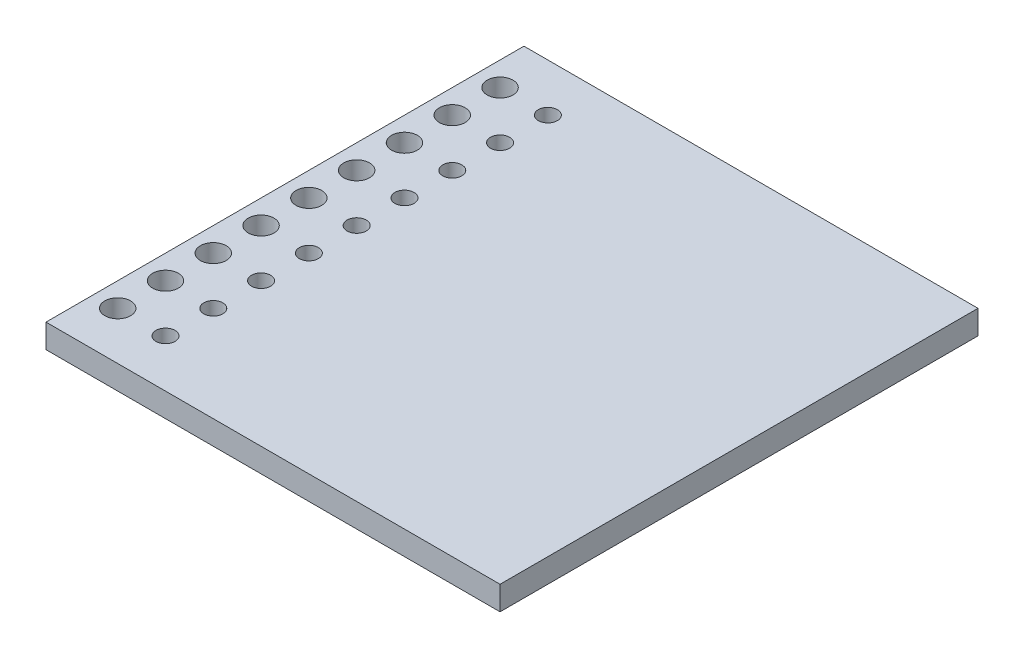
ISO-10303-21;
HEADER;
FILE_DESCRIPTION(('STEP AP214'),'2;1');
FILE_NAME('part.step','',(''),(''),'','','');
FILE_SCHEMA(('AUTOMOTIVE_DESIGN { 1 0 10303 214 1 1 1 1 }'));
ENDSEC;
DATA;
#1=APPLICATION_CONTEXT('core data for automotive mechanical design processes');
#2=APPLICATION_PROTOCOL_DEFINITION('international standard','automotive_design',2000,#1);
#3=PRODUCT_CONTEXT('',#1,'mechanical');
#4=PRODUCT('Part','Part','',(#3));
#5=PRODUCT_RELATED_PRODUCT_CATEGORY('part','',(#4));
#6=PRODUCT_DEFINITION_FORMATION('','',#4);
#7=PRODUCT_DEFINITION_CONTEXT('part definition',#1,'design');
#8=PRODUCT_DEFINITION('design','',#6,#7);
#9=PRODUCT_DEFINITION_SHAPE('','',#8);
#10=(LENGTH_UNIT() NAMED_UNIT(*) SI_UNIT(.MILLI.,.METRE.));
#11=(NAMED_UNIT(*) PLANE_ANGLE_UNIT() SI_UNIT($,.RADIAN.));
#12=(NAMED_UNIT(*) SI_UNIT($,.STERADIAN.) SOLID_ANGLE_UNIT());
#13=UNCERTAINTY_MEASURE_WITH_UNIT(LENGTH_MEASURE(1.E-05),#10,'distance_accuracy_value','');
#14=(GEOMETRIC_REPRESENTATION_CONTEXT(3) GLOBAL_UNCERTAINTY_ASSIGNED_CONTEXT((#13)) GLOBAL_UNIT_ASSIGNED_CONTEXT((#10,
#11,#12)) REPRESENTATION_CONTEXT('',''));
#15=CARTESIAN_POINT('',(0.,0.,0.));
#16=DIRECTION('',(0.,0.,1.));
#17=DIRECTION('',(1.,0.,0.));
#18=AXIS2_PLACEMENT_3D('',#15,#16,#17);
#19=CARTESIAN_POINT('',(50.8,6.35,63.5));
#20=DIRECTION('',(-1.,0.,0.));
#21=DIRECTION('',(0.,0.,1.));
#22=AXIS2_PLACEMENT_3D('',#19,#20,#21);
#23=PLANE('',#22);
#24=DIRECTION('',(0.,0.,-1.));
#25=VECTOR('',#24,1.);
#26=CARTESIAN_POINT('',(50.8,0.,63.5));
#27=LINE('',#26,#25);
#28=CARTESIAN_POINT('',(50.8,0.,63.5));
#29=VERTEX_POINT('',#28);
#30=CARTESIAN_POINT('',(50.8,0.,-63.5));
#31=VERTEX_POINT('',#30);
#32=EDGE_CURVE('E84',#29,#31,#27,.T.);
#33=ORIENTED_EDGE('',*,*,#32,.T.);
#34=DIRECTION('',(0.,-1.,0.));
#35=VECTOR('',#34,1.);
#36=CARTESIAN_POINT('',(50.8,6.35,-63.5));
#37=LINE('',#36,#35);
#38=CARTESIAN_POINT('',(50.8,6.35,-63.5));
#39=VERTEX_POINT('',#38);
#40=EDGE_CURVE('E11',#39,#31,#37,.T.);
#41=ORIENTED_EDGE('',*,*,#40,.F.);
#42=DIRECTION('',(0.,0.,-1.));
#43=VECTOR('',#42,1.);
#44=CARTESIAN_POINT('',(50.8,6.35,63.5));
#45=LINE('',#44,#43);
#46=CARTESIAN_POINT('',(50.8,6.35,63.5));
#47=VERTEX_POINT('',#46);
#48=EDGE_CURVE('E78',#47,#39,#45,.T.);
#49=ORIENTED_EDGE('',*,*,#48,.F.);
#50=DIRECTION('',(0.,-1.,0.));
#51=VECTOR('',#50,1.);
#52=CARTESIAN_POINT('',(50.8,6.35,63.5));
#53=LINE('',#52,#51);
#54=EDGE_CURVE('E40',#47,#29,#53,.T.);
#55=ORIENTED_EDGE('',*,*,#54,.T.);
#56=EDGE_LOOP('',(#33,#41,#49,#55));
#57=FACE_BOUND('',#56,.T.);
#58=ADVANCED_FACE('F33',(#57),#23,.F.);
#59=CARTESIAN_POINT('',(-50.8,6.35,-63.5));
#60=DIRECTION('',(0.,0.,1.));
#61=DIRECTION('',(1.,0.,0.));
#62=AXIS2_PLACEMENT_3D('',#59,#60,#61);
#63=PLANE('',#62);
#64=DIRECTION('',(-1.,0.,0.));
#65=VECTOR('',#64,1.);
#66=CARTESIAN_POINT('',(-50.8,0.,-63.5));
#67=LINE('',#66,#65);
#68=CARTESIAN_POINT('',(-69.85,0.,-63.5));
#69=VERTEX_POINT('',#68);
#70=EDGE_CURVE('E79',#31,#69,#67,.T.);
#71=ORIENTED_EDGE('',*,*,#70,.T.);
#72=DIRECTION('',(0.,1.,0.));
#73=VECTOR('',#72,1.);
#74=CARTESIAN_POINT('',(-69.85,0.,-63.5));
#75=LINE('',#74,#73);
#76=CARTESIAN_POINT('',(-69.85,6.35,-63.5));
#77=VERTEX_POINT('',#76);
#78=EDGE_CURVE('E47',#69,#77,#75,.T.);
#79=ORIENTED_EDGE('',*,*,#78,.T.);
#80=DIRECTION('',(-1.,0.,0.));
#81=VECTOR('',#80,1.);
#82=CARTESIAN_POINT('',(-50.8,6.35,-63.5));
#83=LINE('',#82,#81);
#84=EDGE_CURVE('E96',#39,#77,#83,.T.);
#85=ORIENTED_EDGE('',*,*,#84,.F.);
#86=ORIENTED_EDGE('',*,*,#40,.T.);
#87=EDGE_LOOP('',(#71,#79,#85,#86));
#88=FACE_BOUND('',#87,.T.);
#89=ADVANCED_FACE('F269',(#88),#63,.F.);
#90=CARTESIAN_POINT('',(-50.8,6.35,63.5));
#91=DIRECTION('',(0.,0.,-1.));
#92=DIRECTION('',(-1.,0.,0.));
#93=AXIS2_PLACEMENT_3D('',#90,#91,#92);
#94=PLANE('',#93);
#95=DIRECTION('',(1.,0.,0.));
#96=VECTOR('',#95,1.);
#97=CARTESIAN_POINT('',(-50.8,6.35,63.5));
#98=LINE('',#97,#96);
#99=CARTESIAN_POINT('',(-69.85,6.35,63.5));
#100=VERTEX_POINT('',#99);
#101=EDGE_CURVE('E56',#100,#47,#98,.T.);
#102=ORIENTED_EDGE('',*,*,#101,.F.);
#103=DIRECTION('',(0.,1.,0.));
#104=VECTOR('',#103,1.);
#105=CARTESIAN_POINT('',(-69.85,0.,63.5));
#106=LINE('',#105,#104);
#107=CARTESIAN_POINT('',(-69.85,0.,63.5));
#108=VERTEX_POINT('',#107);
#109=EDGE_CURVE('E75',#108,#100,#106,.T.);
#110=ORIENTED_EDGE('',*,*,#109,.F.);
#111=DIRECTION('',(1.,0.,0.));
#112=VECTOR('',#111,1.);
#113=CARTESIAN_POINT('',(-50.8,0.,63.5));
#114=LINE('',#113,#112);
#115=EDGE_CURVE('E70',#108,#29,#114,.T.);
#116=ORIENTED_EDGE('',*,*,#115,.T.);
#117=ORIENTED_EDGE('',*,*,#54,.F.);
#118=EDGE_LOOP('',(#102,#110,#116,#117));
#119=FACE_BOUND('',#118,.T.);
#120=ADVANCED_FACE('F72',(#119),#94,.F.);
#121=CARTESIAN_POINT('',(0.,6.35,0.));
#122=DIRECTION('',(0.,-1.,0.));
#123=DIRECTION('',(0.,0.,-1.));
#124=AXIS2_PLACEMENT_3D('',#121,#122,#123);
#125=PLANE('',#124);
#126=CARTESIAN_POINT('',(-50.8,6.35,-50.8));
#127=DIRECTION('',(0.,1.,0.));
#128=DIRECTION('',(0.,0.,1.));
#129=AXIS2_PLACEMENT_3D('',#126,#127,#128);
#130=CIRCLE('',#129,2.54);
#131=CARTESIAN_POINT('',(-50.8,6.35,-48.26));
#132=VERTEX_POINT('',#131);
#133=EDGE_CURVE('E155',#132,#132,#130,.T.);
#134=ORIENTED_EDGE('',*,*,#133,.F.);
#135=EDGE_LOOP('',(#134));
#136=FACE_BOUND('',#135,.T.);
#137=CARTESIAN_POINT('',(-50.7999999999999,6.35,-38.1));
#138=DIRECTION('',(0.,1.,0.));
#139=DIRECTION('',(0.,0.,1.));
#140=AXIS2_PLACEMENT_3D('',#137,#138,#139);
#141=CIRCLE('',#140,2.54);
#142=CARTESIAN_POINT('',(-50.7999999999999,6.35,-35.56));
#143=VERTEX_POINT('',#142);
#144=EDGE_CURVE('E202',#143,#143,#141,.T.);
#145=ORIENTED_EDGE('',*,*,#144,.F.);
#146=EDGE_LOOP('',(#145));
#147=FACE_BOUND('',#146,.T.);
#148=CARTESIAN_POINT('',(-50.7999999999997,6.35,-25.4));
#149=DIRECTION('',(0.,1.,0.));
#150=DIRECTION('',(0.,0.,1.));
#151=AXIS2_PLACEMENT_3D('',#148,#149,#150);
#152=CIRCLE('',#151,2.54);
#153=CARTESIAN_POINT('',(-50.7999999999997,6.35,-22.86));
#154=VERTEX_POINT('',#153);
#155=EDGE_CURVE('E196',#154,#154,#152,.T.);
#156=ORIENTED_EDGE('',*,*,#155,.F.);
#157=EDGE_LOOP('',(#156));
#158=FACE_BOUND('',#157,.T.);
#159=CARTESIAN_POINT('',(-50.7999999999996,6.35,-12.7));
#160=DIRECTION('',(0.,1.,0.));
#161=DIRECTION('',(0.,0.,1.));
#162=AXIS2_PLACEMENT_3D('',#159,#160,#161);
#163=CIRCLE('',#162,2.54);
#164=CARTESIAN_POINT('',(-50.7999999999996,6.35,-10.16));
#165=VERTEX_POINT('',#164);
#166=EDGE_CURVE('E190',#165,#165,#163,.T.);
#167=ORIENTED_EDGE('',*,*,#166,.F.);
#168=EDGE_LOOP('',(#167));
#169=FACE_BOUND('',#168,.T.);
#170=CARTESIAN_POINT('',(-50.7999999999995,6.35,0.));
#171=DIRECTION('',(0.,1.,0.));
#172=DIRECTION('',(0.,0.,1.));
#173=AXIS2_PLACEMENT_3D('',#170,#171,#172);
#174=CIRCLE('',#173,2.54);
#175=CARTESIAN_POINT('',(-50.7999999999995,6.35,2.54));
#176=VERTEX_POINT('',#175);
#177=EDGE_CURVE('E184',#176,#176,#174,.T.);
#178=ORIENTED_EDGE('',*,*,#177,.F.);
#179=EDGE_LOOP('',(#178));
#180=FACE_BOUND('',#179,.T.);
#181=CARTESIAN_POINT('',(-50.7999999999993,6.35,12.7));
#182=DIRECTION('',(0.,1.,0.));
#183=DIRECTION('',(0.,0.,1.));
#184=AXIS2_PLACEMENT_3D('',#181,#182,#183);
#185=CIRCLE('',#184,2.54);
#186=CARTESIAN_POINT('',(-50.7999999999993,6.35,15.24));
#187=VERTEX_POINT('',#186);
#188=EDGE_CURVE('E178',#187,#187,#185,.T.);
#189=ORIENTED_EDGE('',*,*,#188,.F.);
#190=EDGE_LOOP('',(#189));
#191=FACE_BOUND('',#190,.T.);
#192=CARTESIAN_POINT('',(-50.7999999999992,6.35,25.4));
#193=DIRECTION('',(0.,1.,0.));
#194=DIRECTION('',(0.,0.,1.));
#195=AXIS2_PLACEMENT_3D('',#192,#193,#194);
#196=CIRCLE('',#195,2.54);
#197=CARTESIAN_POINT('',(-50.7999999999992,6.35,27.94));
#198=VERTEX_POINT('',#197);
#199=EDGE_CURVE('E172',#198,#198,#196,.T.);
#200=ORIENTED_EDGE('',*,*,#199,.F.);
#201=EDGE_LOOP('',(#200));
#202=FACE_BOUND('',#201,.T.);
#203=CARTESIAN_POINT('',(-50.7999999999991,6.35,38.1));
#204=DIRECTION('',(0.,1.,0.));
#205=DIRECTION('',(0.,0.,1.));
#206=AXIS2_PLACEMENT_3D('',#203,#204,#205);
#207=CIRCLE('',#206,2.54);
#208=CARTESIAN_POINT('',(-50.7999999999991,6.35,40.64));
#209=VERTEX_POINT('',#208);
#210=EDGE_CURVE('E166',#209,#209,#207,.T.);
#211=ORIENTED_EDGE('',*,*,#210,.F.);
#212=EDGE_LOOP('',(#211));
#213=FACE_BOUND('',#212,.T.);
#214=CARTESIAN_POINT('',(-50.799999999999,6.35,50.8));
#215=DIRECTION('',(0.,1.,0.));
#216=DIRECTION('',(0.,0.,1.));
#217=AXIS2_PLACEMENT_3D('',#214,#215,#216);
#218=CIRCLE('',#217,2.54);
#219=CARTESIAN_POINT('',(-50.799999999999,6.35,53.34));
#220=VERTEX_POINT('',#219);
#221=EDGE_CURVE('E160',#220,#220,#218,.T.);
#222=ORIENTED_EDGE('',*,*,#221,.F.);
#223=EDGE_LOOP('',(#222));
#224=FACE_BOUND('',#223,.T.);
#225=ORIENTED_EDGE('',*,*,#84,.T.);
#226=DIRECTION('',(0.,0.,-1.));
#227=VECTOR('',#226,1.);
#228=CARTESIAN_POINT('',(-69.85,6.35,63.5));
#229=LINE('',#228,#227);
#230=EDGE_CURVE('E153',#100,#77,#229,.T.);
#231=ORIENTED_EDGE('',*,*,#230,.F.);
#232=ORIENTED_EDGE('',*,*,#101,.T.);
#233=ORIENTED_EDGE('',*,*,#48,.T.);
#234=EDGE_LOOP('',(#225,#231,#232,#233));
#235=FACE_BOUND('',#234,.T.);
#236=CARTESIAN_POINT('',(-63.4999999999989,6.35,50.8));
#237=DIRECTION('',(0.,1.,0.));
#238=DIRECTION('',(0.,0.,1.));
#239=AXIS2_PLACEMENT_3D('',#236,#237,#238);
#240=CIRCLE('',#239,3.42899999999999);
#241=CARTESIAN_POINT('',(-63.4999999999989,6.35,54.229));
#242=VERTEX_POINT('',#241);
#243=EDGE_CURVE('E145',#242,#242,#240,.T.);
#244=ORIENTED_EDGE('',*,*,#243,.F.);
#245=EDGE_LOOP('',(#244));
#246=FACE_BOUND('',#245,.T.);
#247=CARTESIAN_POINT('',(-63.4999999999991,6.35,38.1));
#248=DIRECTION('',(0.,1.,0.));
#249=DIRECTION('',(0.,0.,1.));
#250=AXIS2_PLACEMENT_3D('',#247,#248,#249);
#251=CIRCLE('',#250,3.429);
#252=CARTESIAN_POINT('',(-63.4999999999991,6.35,41.529));
#253=VERTEX_POINT('',#252);
#254=EDGE_CURVE('E139',#253,#253,#251,.T.);
#255=ORIENTED_EDGE('',*,*,#254,.F.);
#256=EDGE_LOOP('',(#255));
#257=FACE_BOUND('',#256,.T.);
#258=CARTESIAN_POINT('',(-63.4999999999992,6.35,25.4));
#259=DIRECTION('',(0.,1.,0.));
#260=DIRECTION('',(0.,0.,1.));
#261=AXIS2_PLACEMENT_3D('',#258,#259,#260);
#262=CIRCLE('',#261,3.42900000000001);
#263=CARTESIAN_POINT('',(-63.4999999999992,6.35,28.829));
#264=VERTEX_POINT('',#263);
#265=EDGE_CURVE('E133',#264,#264,#262,.T.);
#266=ORIENTED_EDGE('',*,*,#265,.F.);
#267=EDGE_LOOP('',(#266));
#268=FACE_BOUND('',#267,.T.);
#269=CARTESIAN_POINT('',(-63.4999999999993,6.35,12.7));
#270=DIRECTION('',(0.,1.,0.));
#271=DIRECTION('',(0.,0.,1.));
#272=AXIS2_PLACEMENT_3D('',#269,#270,#271);
#273=CIRCLE('',#272,3.429);
#274=CARTESIAN_POINT('',(-63.4999999999993,6.35,16.129));
#275=VERTEX_POINT('',#274);
#276=EDGE_CURVE('E127',#275,#275,#273,.T.);
#277=ORIENTED_EDGE('',*,*,#276,.F.);
#278=EDGE_LOOP('',(#277));
#279=FACE_BOUND('',#278,.T.);
#280=CARTESIAN_POINT('',(-63.4999999999995,6.35,0.));
#281=DIRECTION('',(0.,1.,0.));
#282=DIRECTION('',(0.,0.,1.));
#283=AXIS2_PLACEMENT_3D('',#280,#281,#282);
#284=CIRCLE('',#283,3.42899999999999);
#285=CARTESIAN_POINT('',(-63.4999999999995,6.35,3.42899999999999));
#286=VERTEX_POINT('',#285);
#287=EDGE_CURVE('E121',#286,#286,#284,.T.);
#288=ORIENTED_EDGE('',*,*,#287,.F.);
#289=EDGE_LOOP('',(#288));
#290=FACE_BOUND('',#289,.T.);
#291=CARTESIAN_POINT('',(-63.4999999999996,6.35,-12.7));
#292=DIRECTION('',(0.,1.,0.));
#293=DIRECTION('',(0.,0.,1.));
#294=AXIS2_PLACEMENT_3D('',#291,#292,#293);
#295=CIRCLE('',#294,3.429);
#296=CARTESIAN_POINT('',(-63.4999999999996,6.35,-9.271));
#297=VERTEX_POINT('',#296);
#298=EDGE_CURVE('E115',#297,#297,#295,.T.);
#299=ORIENTED_EDGE('',*,*,#298,.F.);
#300=EDGE_LOOP('',(#299));
#301=FACE_BOUND('',#300,.T.);
#302=CARTESIAN_POINT('',(-63.4999999999999,6.35,-38.1));
#303=DIRECTION('',(0.,1.,0.));
#304=DIRECTION('',(0.,0.,1.));
#305=AXIS2_PLACEMENT_3D('',#302,#303,#304);
#306=CIRCLE('',#305,3.42900000000001);
#307=CARTESIAN_POINT('',(-63.4999999999999,6.35,-34.671));
#308=VERTEX_POINT('',#307);
#309=EDGE_CURVE('E109',#308,#308,#306,.T.);
#310=ORIENTED_EDGE('',*,*,#309,.F.);
#311=EDGE_LOOP('',(#310));
#312=FACE_BOUND('',#311,.T.);
#313=CARTESIAN_POINT('',(-63.4999999999998,6.35,-25.4));
#314=DIRECTION('',(0.,1.,0.));
#315=DIRECTION('',(0.,0.,1.));
#316=AXIS2_PLACEMENT_3D('',#313,#314,#315);
#317=CIRCLE('',#316,3.429);
#318=CARTESIAN_POINT('',(-63.4999999999998,6.35,-21.971));
#319=VERTEX_POINT('',#318);
#320=EDGE_CURVE('E103',#319,#319,#317,.T.);
#321=ORIENTED_EDGE('',*,*,#320,.F.);
#322=EDGE_LOOP('',(#321));
#323=FACE_BOUND('',#322,.T.);
#324=CARTESIAN_POINT('',(-63.5,6.35,-50.8));
#325=DIRECTION('',(0.,1.,0.));
#326=DIRECTION('',(0.,0.,1.));
#327=AXIS2_PLACEMENT_3D('',#324,#325,#326);
#328=CIRCLE('',#327,3.429);
#329=CARTESIAN_POINT('',(-63.5,6.35,-47.371));
#330=VERTEX_POINT('',#329);
#331=EDGE_CURVE('E92',#330,#330,#328,.T.);
#332=ORIENTED_EDGE('',*,*,#331,.F.);
#333=EDGE_LOOP('',(#332));
#334=FACE_BOUND('',#333,.T.);
#335=ADVANCED_FACE('F214',(#136,#147,#158,#169,#180,#191,#202,#213,#224,#235,#246,#257,#268,
#279,#290,#301,#312,#323,#334),#125,.F.);
#336=CARTESIAN_POINT('',(0.,0.,0.));
#337=DIRECTION('',(0.,-1.,0.));
#338=DIRECTION('',(0.,0.,-1.));
#339=AXIS2_PLACEMENT_3D('',#336,#337,#338);
#340=PLANE('',#339);
#341=CARTESIAN_POINT('',(-50.8,0.,-50.8));
#342=DIRECTION('',(0.,1.,0.));
#343=DIRECTION('',(0.,0.,1.));
#344=AXIS2_PLACEMENT_3D('',#341,#342,#343);
#345=CIRCLE('',#344,2.54);
#346=CARTESIAN_POINT('',(-50.8,0.,-48.26));
#347=VERTEX_POINT('',#346);
#348=EDGE_CURVE('E205',#347,#347,#345,.T.);
#349=ORIENTED_EDGE('',*,*,#348,.T.);
#350=EDGE_LOOP('',(#349));
#351=FACE_BOUND('',#350,.T.);
#352=CARTESIAN_POINT('',(-50.7999999999999,0.,-38.1));
#353=DIRECTION('',(0.,1.,0.));
#354=DIRECTION('',(0.,0.,1.));
#355=AXIS2_PLACEMENT_3D('',#352,#353,#354);
#356=CIRCLE('',#355,2.54);
#357=CARTESIAN_POINT('',(-50.7999999999999,0.,-35.56));
#358=VERTEX_POINT('',#357);
#359=EDGE_CURVE('E199',#358,#358,#356,.T.);
#360=ORIENTED_EDGE('',*,*,#359,.T.);
#361=EDGE_LOOP('',(#360));
#362=FACE_BOUND('',#361,.T.);
#363=CARTESIAN_POINT('',(-50.7999999999997,0.,-25.4));
#364=DIRECTION('',(0.,1.,0.));
#365=DIRECTION('',(0.,0.,1.));
#366=AXIS2_PLACEMENT_3D('',#363,#364,#365);
#367=CIRCLE('',#366,2.54);
#368=CARTESIAN_POINT('',(-50.7999999999997,0.,-22.86));
#369=VERTEX_POINT('',#368);
#370=EDGE_CURVE('E193',#369,#369,#367,.T.);
#371=ORIENTED_EDGE('',*,*,#370,.T.);
#372=EDGE_LOOP('',(#371));
#373=FACE_BOUND('',#372,.T.);
#374=CARTESIAN_POINT('',(-50.7999999999996,0.,-12.7));
#375=DIRECTION('',(0.,1.,0.));
#376=DIRECTION('',(0.,0.,1.));
#377=AXIS2_PLACEMENT_3D('',#374,#375,#376);
#378=CIRCLE('',#377,2.54);
#379=CARTESIAN_POINT('',(-50.7999999999996,0.,-10.16));
#380=VERTEX_POINT('',#379);
#381=EDGE_CURVE('E187',#380,#380,#378,.T.);
#382=ORIENTED_EDGE('',*,*,#381,.T.);
#383=EDGE_LOOP('',(#382));
#384=FACE_BOUND('',#383,.T.);
#385=CARTESIAN_POINT('',(-50.7999999999995,0.,0.));
#386=DIRECTION('',(0.,1.,0.));
#387=DIRECTION('',(0.,0.,1.));
#388=AXIS2_PLACEMENT_3D('',#385,#386,#387);
#389=CIRCLE('',#388,2.54);
#390=CARTESIAN_POINT('',(-50.7999999999995,0.,2.54));
#391=VERTEX_POINT('',#390);
#392=EDGE_CURVE('E181',#391,#391,#389,.T.);
#393=ORIENTED_EDGE('',*,*,#392,.T.);
#394=EDGE_LOOP('',(#393));
#395=FACE_BOUND('',#394,.T.);
#396=CARTESIAN_POINT('',(-50.7999999999993,0.,12.7));
#397=DIRECTION('',(0.,1.,0.));
#398=DIRECTION('',(0.,0.,1.));
#399=AXIS2_PLACEMENT_3D('',#396,#397,#398);
#400=CIRCLE('',#399,2.54);
#401=CARTESIAN_POINT('',(-50.7999999999993,0.,15.24));
#402=VERTEX_POINT('',#401);
#403=EDGE_CURVE('E175',#402,#402,#400,.T.);
#404=ORIENTED_EDGE('',*,*,#403,.T.);
#405=EDGE_LOOP('',(#404));
#406=FACE_BOUND('',#405,.T.);
#407=CARTESIAN_POINT('',(-50.7999999999992,0.,25.4));
#408=DIRECTION('',(0.,1.,0.));
#409=DIRECTION('',(0.,0.,1.));
#410=AXIS2_PLACEMENT_3D('',#407,#408,#409);
#411=CIRCLE('',#410,2.54);
#412=CARTESIAN_POINT('',(-50.7999999999992,0.,27.94));
#413=VERTEX_POINT('',#412);
#414=EDGE_CURVE('E169',#413,#413,#411,.T.);
#415=ORIENTED_EDGE('',*,*,#414,.T.);
#416=EDGE_LOOP('',(#415));
#417=FACE_BOUND('',#416,.T.);
#418=CARTESIAN_POINT('',(-50.7999999999991,0.,38.1));
#419=DIRECTION('',(0.,1.,0.));
#420=DIRECTION('',(0.,0.,1.));
#421=AXIS2_PLACEMENT_3D('',#418,#419,#420);
#422=CIRCLE('',#421,2.54);
#423=CARTESIAN_POINT('',(-50.7999999999991,0.,40.64));
#424=VERTEX_POINT('',#423);
#425=EDGE_CURVE('E163',#424,#424,#422,.T.);
#426=ORIENTED_EDGE('',*,*,#425,.T.);
#427=EDGE_LOOP('',(#426));
#428=FACE_BOUND('',#427,.T.);
#429=CARTESIAN_POINT('',(-50.799999999999,0.,50.8));
#430=DIRECTION('',(0.,1.,0.));
#431=DIRECTION('',(0.,0.,1.));
#432=AXIS2_PLACEMENT_3D('',#429,#430,#431);
#433=CIRCLE('',#432,2.54);
#434=CARTESIAN_POINT('',(-50.799999999999,0.,53.34));
#435=VERTEX_POINT('',#434);
#436=EDGE_CURVE('E157',#435,#435,#433,.T.);
#437=ORIENTED_EDGE('',*,*,#436,.T.);
#438=EDGE_LOOP('',(#437));
#439=FACE_BOUND('',#438,.T.);
#440=DIRECTION('',(0.,0.,-1.));
#441=VECTOR('',#440,1.);
#442=CARTESIAN_POINT('',(-69.85,0.,63.5));
#443=LINE('',#442,#441);
#444=EDGE_CURVE('E151',#108,#69,#443,.T.);
#445=ORIENTED_EDGE('',*,*,#444,.T.);
#446=ORIENTED_EDGE('',*,*,#70,.F.);
#447=ORIENTED_EDGE('',*,*,#32,.F.);
#448=ORIENTED_EDGE('',*,*,#115,.F.);
#449=EDGE_LOOP('',(#445,#446,#447,#448));
#450=FACE_BOUND('',#449,.T.);
#451=CARTESIAN_POINT('',(-63.4999999999989,0.,50.8));
#452=DIRECTION('',(0.,1.,0.));
#453=DIRECTION('',(0.,0.,1.));
#454=AXIS2_PLACEMENT_3D('',#451,#452,#453);
#455=CIRCLE('',#454,3.42899999999999);
#456=CARTESIAN_POINT('',(-63.4999999999989,0.,54.229));
#457=VERTEX_POINT('',#456);
#458=EDGE_CURVE('E142',#457,#457,#455,.T.);
#459=ORIENTED_EDGE('',*,*,#458,.T.);
#460=EDGE_LOOP('',(#459));
#461=FACE_BOUND('',#460,.T.);
#462=CARTESIAN_POINT('',(-63.4999999999991,0.,38.1));
#463=DIRECTION('',(0.,1.,0.));
#464=DIRECTION('',(0.,0.,1.));
#465=AXIS2_PLACEMENT_3D('',#462,#463,#464);
#466=CIRCLE('',#465,3.429);
#467=CARTESIAN_POINT('',(-63.4999999999991,0.,41.529));
#468=VERTEX_POINT('',#467);
#469=EDGE_CURVE('E136',#468,#468,#466,.T.);
#470=ORIENTED_EDGE('',*,*,#469,.T.);
#471=EDGE_LOOP('',(#470));
#472=FACE_BOUND('',#471,.T.);
#473=CARTESIAN_POINT('',(-63.4999999999992,0.,25.4));
#474=DIRECTION('',(0.,1.,0.));
#475=DIRECTION('',(0.,0.,1.));
#476=AXIS2_PLACEMENT_3D('',#473,#474,#475);
#477=CIRCLE('',#476,3.42900000000001);
#478=CARTESIAN_POINT('',(-63.4999999999992,0.,28.829));
#479=VERTEX_POINT('',#478);
#480=EDGE_CURVE('E130',#479,#479,#477,.T.);
#481=ORIENTED_EDGE('',*,*,#480,.T.);
#482=EDGE_LOOP('',(#481));
#483=FACE_BOUND('',#482,.T.);
#484=CARTESIAN_POINT('',(-63.4999999999993,0.,12.7));
#485=DIRECTION('',(0.,1.,0.));
#486=DIRECTION('',(0.,0.,1.));
#487=AXIS2_PLACEMENT_3D('',#484,#485,#486);
#488=CIRCLE('',#487,3.429);
#489=CARTESIAN_POINT('',(-63.4999999999993,0.,16.129));
#490=VERTEX_POINT('',#489);
#491=EDGE_CURVE('E124',#490,#490,#488,.T.);
#492=ORIENTED_EDGE('',*,*,#491,.T.);
#493=EDGE_LOOP('',(#492));
#494=FACE_BOUND('',#493,.T.);
#495=CARTESIAN_POINT('',(-63.4999999999995,0.,0.));
#496=DIRECTION('',(0.,1.,0.));
#497=DIRECTION('',(0.,0.,1.));
#498=AXIS2_PLACEMENT_3D('',#495,#496,#497);
#499=CIRCLE('',#498,3.42899999999999);
#500=CARTESIAN_POINT('',(-63.4999999999995,0.,3.42899999999999));
#501=VERTEX_POINT('',#500);
#502=EDGE_CURVE('E118',#501,#501,#499,.T.);
#503=ORIENTED_EDGE('',*,*,#502,.T.);
#504=EDGE_LOOP('',(#503));
#505=FACE_BOUND('',#504,.T.);
#506=CARTESIAN_POINT('',(-63.4999999999996,0.,-12.7));
#507=DIRECTION('',(0.,1.,0.));
#508=DIRECTION('',(0.,0.,1.));
#509=AXIS2_PLACEMENT_3D('',#506,#507,#508);
#510=CIRCLE('',#509,3.429);
#511=CARTESIAN_POINT('',(-63.4999999999996,0.,-9.271));
#512=VERTEX_POINT('',#511);
#513=EDGE_CURVE('E112',#512,#512,#510,.T.);
#514=ORIENTED_EDGE('',*,*,#513,.T.);
#515=EDGE_LOOP('',(#514));
#516=FACE_BOUND('',#515,.T.);
#517=CARTESIAN_POINT('',(-63.4999999999999,0.,-38.1));
#518=DIRECTION('',(0.,1.,0.));
#519=DIRECTION('',(0.,0.,1.));
#520=AXIS2_PLACEMENT_3D('',#517,#518,#519);
#521=CIRCLE('',#520,3.42900000000001);
#522=CARTESIAN_POINT('',(-63.4999999999999,0.,-34.671));
#523=VERTEX_POINT('',#522);
#524=EDGE_CURVE('E106',#523,#523,#521,.T.);
#525=ORIENTED_EDGE('',*,*,#524,.T.);
#526=EDGE_LOOP('',(#525));
#527=FACE_BOUND('',#526,.T.);
#528=CARTESIAN_POINT('',(-63.4999999999998,0.,-25.4));
#529=DIRECTION('',(0.,1.,0.));
#530=DIRECTION('',(0.,0.,1.));
#531=AXIS2_PLACEMENT_3D('',#528,#529,#530);
#532=CIRCLE('',#531,3.429);
#533=CARTESIAN_POINT('',(-63.4999999999998,0.,-21.971));
#534=VERTEX_POINT('',#533);
#535=EDGE_CURVE('E101',#534,#534,#532,.T.);
#536=ORIENTED_EDGE('',*,*,#535,.T.);
#537=EDGE_LOOP('',(#536));
#538=FACE_BOUND('',#537,.T.);
#539=CARTESIAN_POINT('',(-63.5,0.,-50.8));
#540=DIRECTION('',(0.,1.,0.));
#541=DIRECTION('',(0.,0.,1.));
#542=AXIS2_PLACEMENT_3D('',#539,#540,#541);
#543=CIRCLE('',#542,3.429);
#544=CARTESIAN_POINT('',(-63.5,0.,-47.371));
#545=VERTEX_POINT('',#544);
#546=EDGE_CURVE('E88',#545,#545,#543,.T.);
#547=ORIENTED_EDGE('',*,*,#546,.T.);
#548=EDGE_LOOP('',(#547));
#549=FACE_BOUND('',#548,.T.);
#550=ADVANCED_FACE('F85',(#351,#362,#373,#384,#395,#406,#417,#428,#439,#450,#461,#472,#483,#494,
#505,#516,#527,#538,#549),#340,.T.);
#551=CARTESIAN_POINT('',(-63.5,0.,-50.8));
#552=DIRECTION('',(0.,1.,0.));
#553=DIRECTION('',(0.,0.,1.));
#554=AXIS2_PLACEMENT_3D('',#551,#552,#553);
#555=CYLINDRICAL_SURFACE('',#554,3.429);
#556=ORIENTED_EDGE('',*,*,#546,.F.);
#557=EDGE_LOOP('',(#556));
#558=FACE_BOUND('',#557,.T.);
#559=ORIENTED_EDGE('',*,*,#331,.T.);
#560=EDGE_LOOP('',(#559));
#561=FACE_BOUND('',#560,.T.);
#562=ADVANCED_FACE('F253',(#558,#561),#555,.F.);
#563=CARTESIAN_POINT('',(-63.4999999999998,0.,-25.4));
#564=DIRECTION('',(0.,1.,0.));
#565=DIRECTION('',(0.,0.,1.));
#566=AXIS2_PLACEMENT_3D('',#563,#564,#565);
#567=CYLINDRICAL_SURFACE('',#566,3.429);
#568=ORIENTED_EDGE('',*,*,#535,.F.);
#569=EDGE_LOOP('',(#568));
#570=FACE_BOUND('',#569,.T.);
#571=ORIENTED_EDGE('',*,*,#320,.T.);
#572=EDGE_LOOP('',(#571));
#573=FACE_BOUND('',#572,.T.);
#574=ADVANCED_FACE('F255',(#570,#573),#567,.F.);
#575=CARTESIAN_POINT('',(-63.4999999999999,0.,-38.1));
#576=DIRECTION('',(0.,1.,0.));
#577=DIRECTION('',(0.,0.,1.));
#578=AXIS2_PLACEMENT_3D('',#575,#576,#577);
#579=CYLINDRICAL_SURFACE('',#578,3.42900000000001);
#580=ORIENTED_EDGE('',*,*,#524,.F.);
#581=EDGE_LOOP('',(#580));
#582=FACE_BOUND('',#581,.T.);
#583=ORIENTED_EDGE('',*,*,#309,.T.);
#584=EDGE_LOOP('',(#583));
#585=FACE_BOUND('',#584,.T.);
#586=ADVANCED_FACE('F262',(#582,#585),#579,.F.);
#587=CARTESIAN_POINT('',(-63.4999999999996,0.,-12.7));
#588=DIRECTION('',(0.,1.,0.));
#589=DIRECTION('',(0.,0.,1.));
#590=AXIS2_PLACEMENT_3D('',#587,#588,#589);
#591=CYLINDRICAL_SURFACE('',#590,3.429);
#592=ORIENTED_EDGE('',*,*,#513,.F.);
#593=EDGE_LOOP('',(#592));
#594=FACE_BOUND('',#593,.T.);
#595=ORIENTED_EDGE('',*,*,#298,.T.);
#596=EDGE_LOOP('',(#595));
#597=FACE_BOUND('',#596,.T.);
#598=ADVANCED_FACE('F312',(#594,#597),#591,.F.);
#599=CARTESIAN_POINT('',(-63.4999999999995,0.,0.));
#600=DIRECTION('',(0.,1.,0.));
#601=DIRECTION('',(0.,0.,1.));
#602=AXIS2_PLACEMENT_3D('',#599,#600,#601);
#603=CYLINDRICAL_SURFACE('',#602,3.42899999999999);
#604=ORIENTED_EDGE('',*,*,#502,.F.);
#605=EDGE_LOOP('',(#604));
#606=FACE_BOUND('',#605,.T.);
#607=ORIENTED_EDGE('',*,*,#287,.T.);
#608=EDGE_LOOP('',(#607));
#609=FACE_BOUND('',#608,.T.);
#610=ADVANCED_FACE('F308',(#606,#609),#603,.F.);
#611=CARTESIAN_POINT('',(-63.4999999999993,0.,12.7));
#612=DIRECTION('',(0.,1.,0.));
#613=DIRECTION('',(0.,0.,1.));
#614=AXIS2_PLACEMENT_3D('',#611,#612,#613);
#615=CYLINDRICAL_SURFACE('',#614,3.429);
#616=ORIENTED_EDGE('',*,*,#491,.F.);
#617=EDGE_LOOP('',(#616));
#618=FACE_BOUND('',#617,.T.);
#619=ORIENTED_EDGE('',*,*,#276,.T.);
#620=EDGE_LOOP('',(#619));
#621=FACE_BOUND('',#620,.T.);
#622=ADVANCED_FACE('F304',(#618,#621),#615,.F.);
#623=CARTESIAN_POINT('',(-63.4999999999992,0.,25.4));
#624=DIRECTION('',(0.,1.,0.));
#625=DIRECTION('',(0.,0.,1.));
#626=AXIS2_PLACEMENT_3D('',#623,#624,#625);
#627=CYLINDRICAL_SURFACE('',#626,3.42900000000001);
#628=ORIENTED_EDGE('',*,*,#480,.F.);
#629=EDGE_LOOP('',(#628));
#630=FACE_BOUND('',#629,.T.);
#631=ORIENTED_EDGE('',*,*,#265,.T.);
#632=EDGE_LOOP('',(#631));
#633=FACE_BOUND('',#632,.T.);
#634=ADVANCED_FACE('F300',(#630,#633),#627,.F.);
#635=CARTESIAN_POINT('',(-63.4999999999991,0.,38.1));
#636=DIRECTION('',(0.,1.,0.));
#637=DIRECTION('',(0.,0.,1.));
#638=AXIS2_PLACEMENT_3D('',#635,#636,#637);
#639=CYLINDRICAL_SURFACE('',#638,3.429);
#640=ORIENTED_EDGE('',*,*,#469,.F.);
#641=EDGE_LOOP('',(#640));
#642=FACE_BOUND('',#641,.T.);
#643=ORIENTED_EDGE('',*,*,#254,.T.);
#644=EDGE_LOOP('',(#643));
#645=FACE_BOUND('',#644,.T.);
#646=ADVANCED_FACE('F293',(#642,#645),#639,.F.);
#647=CARTESIAN_POINT('',(-63.4999999999989,0.,50.8));
#648=DIRECTION('',(0.,1.,0.));
#649=DIRECTION('',(0.,0.,1.));
#650=AXIS2_PLACEMENT_3D('',#647,#648,#649);
#651=CYLINDRICAL_SURFACE('',#650,3.42899999999999);
#652=ORIENTED_EDGE('',*,*,#458,.F.);
#653=EDGE_LOOP('',(#652));
#654=FACE_BOUND('',#653,.T.);
#655=ORIENTED_EDGE('',*,*,#243,.T.);
#656=EDGE_LOOP('',(#655));
#657=FACE_BOUND('',#656,.T.);
#658=ADVANCED_FACE('F284',(#654,#657),#651,.F.);
#659=CARTESIAN_POINT('',(-69.85,0.,63.5));
#660=DIRECTION('',(1.,0.,0.));
#661=DIRECTION('',(0.,0.,-1.));
#662=AXIS2_PLACEMENT_3D('',#659,#660,#661);
#663=PLANE('',#662);
#664=ORIENTED_EDGE('',*,*,#230,.T.);
#665=ORIENTED_EDGE('',*,*,#78,.F.);
#666=ORIENTED_EDGE('',*,*,#444,.F.);
#667=ORIENTED_EDGE('',*,*,#109,.T.);
#668=EDGE_LOOP('',(#664,#665,#666,#667));
#669=FACE_BOUND('',#668,.T.);
#670=ADVANCED_FACE('F281',(#669),#663,.F.);
#671=CARTESIAN_POINT('',(-50.799999999999,6.35,50.8));
#672=DIRECTION('',(0.,-1.,0.));
#673=DIRECTION('',(0.,0.,-1.));
#674=AXIS2_PLACEMENT_3D('',#671,#672,#673);
#675=CYLINDRICAL_SURFACE('',#674,2.54);
#676=ORIENTED_EDGE('',*,*,#221,.T.);
#677=EDGE_LOOP('',(#676));
#678=FACE_BOUND('',#677,.T.);
#679=ORIENTED_EDGE('',*,*,#436,.F.);
#680=EDGE_LOOP('',(#679));
#681=FACE_BOUND('',#680,.T.);
#682=ADVANCED_FACE('F283',(#678,#681),#675,.F.);
#683=CARTESIAN_POINT('',(-50.7999999999991,6.35,38.1));
#684=DIRECTION('',(0.,-1.,0.));
#685=DIRECTION('',(0.,0.,-1.));
#686=AXIS2_PLACEMENT_3D('',#683,#684,#685);
#687=CYLINDRICAL_SURFACE('',#686,2.54);
#688=ORIENTED_EDGE('',*,*,#210,.T.);
#689=EDGE_LOOP('',(#688));
#690=FACE_BOUND('',#689,.T.);
#691=ORIENTED_EDGE('',*,*,#425,.F.);
#692=EDGE_LOOP('',(#691));
#693=FACE_BOUND('',#692,.T.);
#694=ADVANCED_FACE('F290',(#690,#693),#687,.F.);
#695=CARTESIAN_POINT('',(-50.7999999999992,6.35,25.4));
#696=DIRECTION('',(0.,-1.,0.));
#697=DIRECTION('',(0.,0.,-1.));
#698=AXIS2_PLACEMENT_3D('',#695,#696,#697);
#699=CYLINDRICAL_SURFACE('',#698,2.54);
#700=ORIENTED_EDGE('',*,*,#199,.T.);
#701=EDGE_LOOP('',(#700));
#702=FACE_BOUND('',#701,.T.);
#703=ORIENTED_EDGE('',*,*,#414,.F.);
#704=EDGE_LOOP('',(#703));
#705=FACE_BOUND('',#704,.T.);
#706=ADVANCED_FACE('F400',(#702,#705),#699,.F.);
#707=CARTESIAN_POINT('',(-50.7999999999993,6.35,12.7));
#708=DIRECTION('',(0.,-1.,0.));
#709=DIRECTION('',(0.,0.,-1.));
#710=AXIS2_PLACEMENT_3D('',#707,#708,#709);
#711=CYLINDRICAL_SURFACE('',#710,2.54);
#712=ORIENTED_EDGE('',*,*,#188,.T.);
#713=EDGE_LOOP('',(#712));
#714=FACE_BOUND('',#713,.T.);
#715=ORIENTED_EDGE('',*,*,#403,.F.);
#716=EDGE_LOOP('',(#715));
#717=FACE_BOUND('',#716,.T.);
#718=ADVANCED_FACE('F409',(#714,#717),#711,.F.);
#719=CARTESIAN_POINT('',(-50.7999999999995,6.35,0.));
#720=DIRECTION('',(0.,-1.,0.));
#721=DIRECTION('',(0.,0.,-1.));
#722=AXIS2_PLACEMENT_3D('',#719,#720,#721);
#723=CYLINDRICAL_SURFACE('',#722,2.54);
#724=ORIENTED_EDGE('',*,*,#177,.T.);
#725=EDGE_LOOP('',(#724));
#726=FACE_BOUND('',#725,.T.);
#727=ORIENTED_EDGE('',*,*,#392,.F.);
#728=EDGE_LOOP('',(#727));
#729=FACE_BOUND('',#728,.T.);
#730=ADVANCED_FACE('F419',(#726,#729),#723,.F.);
#731=CARTESIAN_POINT('',(-50.7999999999996,6.35,-12.7));
#732=DIRECTION('',(0.,-1.,0.));
#733=DIRECTION('',(0.,0.,-1.));
#734=AXIS2_PLACEMENT_3D('',#731,#732,#733);
#735=CYLINDRICAL_SURFACE('',#734,2.54);
#736=ORIENTED_EDGE('',*,*,#166,.T.);
#737=EDGE_LOOP('',(#736));
#738=FACE_BOUND('',#737,.T.);
#739=ORIENTED_EDGE('',*,*,#381,.F.);
#740=EDGE_LOOP('',(#739));
#741=FACE_BOUND('',#740,.T.);
#742=ADVANCED_FACE('F429',(#738,#741),#735,.F.);
#743=CARTESIAN_POINT('',(-50.7999999999997,6.35,-25.4));
#744=DIRECTION('',(0.,-1.,0.));
#745=DIRECTION('',(0.,0.,-1.));
#746=AXIS2_PLACEMENT_3D('',#743,#744,#745);
#747=CYLINDRICAL_SURFACE('',#746,2.54);
#748=ORIENTED_EDGE('',*,*,#155,.T.);
#749=EDGE_LOOP('',(#748));
#750=FACE_BOUND('',#749,.T.);
#751=ORIENTED_EDGE('',*,*,#370,.F.);
#752=EDGE_LOOP('',(#751));
#753=FACE_BOUND('',#752,.T.);
#754=ADVANCED_FACE('F439',(#750,#753),#747,.F.);
#755=CARTESIAN_POINT('',(-50.7999999999999,6.35,-38.1));
#756=DIRECTION('',(0.,-1.,0.));
#757=DIRECTION('',(0.,0.,-1.));
#758=AXIS2_PLACEMENT_3D('',#755,#756,#757);
#759=CYLINDRICAL_SURFACE('',#758,2.54);
#760=ORIENTED_EDGE('',*,*,#144,.T.);
#761=EDGE_LOOP('',(#760));
#762=FACE_BOUND('',#761,.T.);
#763=ORIENTED_EDGE('',*,*,#359,.F.);
#764=EDGE_LOOP('',(#763));
#765=FACE_BOUND('',#764,.T.);
#766=ADVANCED_FACE('F449',(#762,#765),#759,.F.);
#767=CARTESIAN_POINT('',(-50.8,6.35,-50.8));
#768=DIRECTION('',(0.,-1.,0.));
#769=DIRECTION('',(0.,0.,-1.));
#770=AXIS2_PLACEMENT_3D('',#767,#768,#769);
#771=CYLINDRICAL_SURFACE('',#770,2.54);
#772=ORIENTED_EDGE('',*,*,#133,.T.);
#773=EDGE_LOOP('',(#772));
#774=FACE_BOUND('',#773,.T.);
#775=ORIENTED_EDGE('',*,*,#348,.F.);
#776=EDGE_LOOP('',(#775));
#777=FACE_BOUND('',#776,.T.);
#778=ADVANCED_FACE('F211',(#774,#777),#771,.F.);
#779=CLOSED_SHELL('',(#58,#89,#120,#335,#550,#562,#574,#586,#598,#610,#622,#634,#646,#658,#670,
#682,#694,#706,#718,#730,#742,#754,#766,#778));
#780=MANIFOLD_SOLID_BREP('B2',#779);
#781=ADVANCED_BREP_SHAPE_REPRESENTATION('',(#18,#780),#14);
#782=SHAPE_DEFINITION_REPRESENTATION(#9,#781);
ENDSEC;
END-ISO-10303-21;
